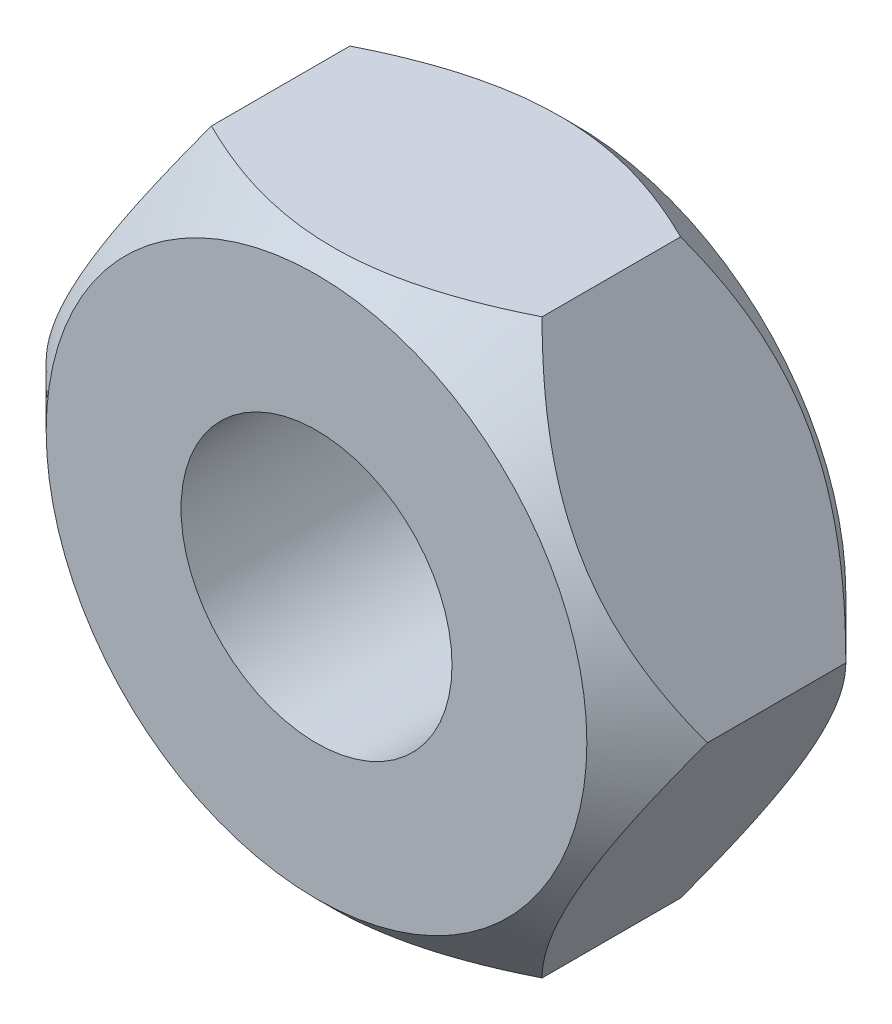
ISO-10303-21;
HEADER;
FILE_DESCRIPTION(('STEP AP214'),'2;1');
FILE_NAME('part.step','',(''),(''),'','','');
FILE_SCHEMA(('AUTOMOTIVE_DESIGN { 1 0 10303 214 1 1 1 1 }'));
ENDSEC;
DATA;
#1=APPLICATION_CONTEXT('core data for automotive mechanical design processes');
#2=APPLICATION_PROTOCOL_DEFINITION('international standard','automotive_design',2000,#1);
#3=PRODUCT_CONTEXT('',#1,'mechanical');
#4=PRODUCT('Part','Part','',(#3));
#5=PRODUCT_RELATED_PRODUCT_CATEGORY('part','',(#4));
#6=PRODUCT_DEFINITION_FORMATION('','',#4);
#7=PRODUCT_DEFINITION_CONTEXT('part definition',#1,'design');
#8=PRODUCT_DEFINITION('design','',#6,#7);
#9=PRODUCT_DEFINITION_SHAPE('','',#8);
#10=(LENGTH_UNIT() NAMED_UNIT(*) SI_UNIT(.MILLI.,.METRE.));
#11=(NAMED_UNIT(*) PLANE_ANGLE_UNIT() SI_UNIT($,.RADIAN.));
#12=(NAMED_UNIT(*) SI_UNIT($,.STERADIAN.) SOLID_ANGLE_UNIT());
#13=UNCERTAINTY_MEASURE_WITH_UNIT(LENGTH_MEASURE(1.E-05),#10,'distance_accuracy_value','');
#14=(GEOMETRIC_REPRESENTATION_CONTEXT(3) GLOBAL_UNCERTAINTY_ASSIGNED_CONTEXT((#13)) GLOBAL_UNIT_ASSIGNED_CONTEXT((#10,
#11,#12)) REPRESENTATION_CONTEXT('',''));
#15=CARTESIAN_POINT('',(0.,0.,0.));
#16=DIRECTION('',(0.,0.,1.));
#17=DIRECTION('',(1.,0.,0.));
#18=AXIS2_PLACEMENT_3D('',#15,#16,#17);
#19=CARTESIAN_POINT('',(-1.49999999999999,-2.59807621135331,0.));
#20=DIRECTION('',(0.,0.,1.));
#21=DIRECTION('',(1.,0.,0.));
#22=AXIS2_PLACEMENT_3D('',#19,#20,#21);
#23=PLANE('',#22);
#24=CARTESIAN_POINT('',(0.,0.,0.));
#25=DIRECTION('',(0.,0.,1.));
#26=DIRECTION('',(1.,0.,0.));
#27=AXIS2_PLACEMENT_3D('',#24,#25,#26);
#28=CIRCLE('',#27,1.2295);
#29=CARTESIAN_POINT('',(1.2295,0.,0.));
#30=VERTEX_POINT('',#29);
#31=EDGE_CURVE('E84',#30,#30,#28,.T.);
#32=ORIENTED_EDGE('',*,*,#31,.T.);
#33=EDGE_LOOP('',(#32));
#34=FACE_BOUND('',#33,.T.);
#35=CARTESIAN_POINT('',(0.,0.,0.));
#36=DIRECTION('',(0.,0.,1.));
#37=DIRECTION('',(1.,0.,0.));
#38=AXIS2_PLACEMENT_3D('',#35,#36,#37);
#39=CIRCLE('',#38,2.45329348486803);
#40=CARTESIAN_POINT('',(2.45329348486803,0.,0.));
#41=VERTEX_POINT('',#40);
#42=EDGE_CURVE('E19',#41,#41,#39,.T.);
#43=ORIENTED_EDGE('',*,*,#42,.F.);
#44=EDGE_LOOP('',(#43));
#45=FACE_BOUND('',#44,.T.);
#46=ADVANCED_FACE('F15',(#34,#45),#23,.F.);
#47=CARTESIAN_POINT('',(0.,0.,1.175));
#48=DIRECTION('',(0.,0.,1.));
#49=DIRECTION('',(1.,0.,0.));
#50=AXIS2_PLACEMENT_3D('',#47,#48,#49);
#51=CONICAL_SURFACE('',#50,3.62829348486803,0.785398163397447);
#52=ORIENTED_EDGE('',*,*,#42,.T.);
#53=EDGE_LOOP('',(#52));
#54=FACE_BOUND('',#53,.T.);
#55=CARTESIAN_POINT('',(3.00011547005384,0.000200000000002248,0.546821991852221));
#56=CARTESIAN_POINT('',(2.94855277650309,-0.0891092050050035,0.495302882241254));
#57=CARTESIAN_POINT('',(2.89612788326072,-0.179911783682159,0.446809533365483));
#58=CARTESIAN_POINT('',(2.78922773781038,-0.365068266938645,0.358019311509173));
#59=CARTESIAN_POINT('',(2.73474231883022,-0.459439780883969,0.317771842047577));
#60=CARTESIAN_POINT('',(2.62487506883104,-0.649735439970419,0.248827111604444));
#61=CARTESIAN_POINT('',(2.56952121892946,-0.745611120394499,0.219956558191336));
#62=CARTESIAN_POINT('',(2.45759490253746,-0.939473187089476,0.175475455486558));
#63=CARTESIAN_POINT('',(2.40102585535858,-1.03745365093906,0.159831701659996));
#64=CARTESIAN_POINT('',(2.30353224012888,-1.20631754593046,0.145716999971108));
#65=CARTESIAN_POINT('',(2.26273362746701,-1.27698281593915,0.14362755028283));
#66=CARTESIAN_POINT('',(2.18120309212938,-1.4181978455122,0.147147538792101));
#67=CARTESIAN_POINT('',(2.14047119784488,-1.48874755590149,0.152759676052897));
#68=CARTESIAN_POINT('',(2.05939201307723,-1.62918082335532,0.171363472834438));
#69=CARTESIAN_POINT('',(2.01904520425573,-1.69906354615743,0.18436338745856));
#70=CARTESIAN_POINT('',(1.93904928040641,-1.83762055066287,0.217029140781639));
#71=CARTESIAN_POINT('',(1.89940011213716,-1.90629492458305,0.236694468458787));
#72=CARTESIAN_POINT('',(1.79784249258705,-2.0821978815396,0.295074775409952));
#73=CARTESIAN_POINT('',(1.73656371984934,-2.18833582934677,0.338190160111078));
#74=CARTESIAN_POINT('',(1.64645863170301,-2.34440242003669,0.410974750688623));
#75=CARTESIAN_POINT('',(1.61676497746057,-2.39583333784698,0.436547893717545));
#76=CARTESIAN_POINT('',(1.55792768843088,-2.49774251182602,0.490025352046095));
#77=CARTESIAN_POINT('',(1.52878372928708,-2.54822132979679,0.517928236303693));
#78=CARTESIAN_POINT('',(1.49988452994617,-2.59827621135331,0.546821991852221));
#79=B_SPLINE_CURVE_WITH_KNOTS('',3,(#55,#56,#57,#58,#59,#60,#61,#62,#63,#64,#65,#66,#67,#68,#69,
#70,#71,#72,#73,#74,#75,#76,#77,#78),.UNSPECIFIED.,.F.,.F.,(4,2,2,2,2,2,2,2,2,2,2,4),(0.,
0.346074163660385,0.694164747986282,1.03672682350145,1.37842635662141,1.62295169669972,
1.86756275390828,2.11244767848963,2.3573138325552,2.74625844207635,2.94020339848825,
3.13403008860789),.UNSPECIFIED.);
#80=CARTESIAN_POINT('',(3.,0.,0.546706515131974));
#81=VERTEX_POINT('',#80);
#82=CARTESIAN_POINT('',(1.5,-2.59807621135331,0.546706515131971));
#83=VERTEX_POINT('',#82);
#84=EDGE_CURVE('E30',#81,#83,#79,.T.);
#85=ORIENTED_EDGE('',*,*,#84,.T.);
#86=CARTESIAN_POINT('',(-3.80350912944924,-2.59807621135332,2.1528634488245));
#87=CARTESIAN_POINT('',(-3.70778366379152,-2.59807621135332,2.073838586046));
#88=CARTESIAN_POINT('',(-3.61160683557952,-2.59807621135332,1.99535199928628));
#89=CARTESIAN_POINT('',(-3.41811677521425,-2.59807621135332,1.83974359260469));
#90=CARTESIAN_POINT('',(-3.32080326399708,-2.59807621135332,1.7626221200366));
#91=CARTESIAN_POINT('',(-3.12377066439065,-2.59807621135332,1.60922873690963));
#92=CARTESIAN_POINT('',(-3.02403687478413,-2.59807621135332,1.53297564894584));
#93=CARTESIAN_POINT('',(-2.82294264473001,-2.59807621135332,1.38266017924859));
#94=CARTESIAN_POINT('',(-2.72158236587452,-2.59807621135332,1.30859758194266));
#95=CARTESIAN_POINT('',(-2.50688663109645,-2.59807621135332,1.15616788589049));
#96=CARTESIAN_POINT('',(-2.39334766095522,-2.59807621135332,1.07808581847886));
#97=CARTESIAN_POINT('',(-2.16325208419808,-2.59807621135332,0.926376425231334));
#98=CARTESIAN_POINT('',(-2.04669446810094,-2.59807621135332,0.852750617837054));
#99=CARTESIAN_POINT('',(-1.81045230907259,-2.59807621135332,0.711951398300852));
#100=CARTESIAN_POINT('',(-1.69078500292649,-2.59807621135332,0.644749333414072));
#101=CARTESIAN_POINT('',(-1.44712532801577,-2.59807621135332,0.51879394488343));
#102=CARTESIAN_POINT('',(-1.32313694802484,-2.59807621135332,0.460033073114177));
#103=CARTESIAN_POINT('',(-1.10791398561965,-2.59807621135332,0.3700009735435));
#104=CARTESIAN_POINT('',(-1.01793220088155,-2.59807621135332,0.335756538677002));
#105=CARTESIAN_POINT('',(-0.835493617661211,-2.59807621135332,0.274466008098753));
#106=CARTESIAN_POINT('',(-0.743036484527009,-2.59807621135332,0.247420891154486));
#107=CARTESIAN_POINT('',(-0.558099551090686,-2.59807621135332,0.202572224289124));
#108=CARTESIAN_POINT('',(-0.465668229321029,-2.59807621135332,0.184572217079036));
#109=CARTESIAN_POINT('',(-0.279437905275911,-2.59807621135331,0.15814392353461));
#110=CARTESIAN_POINT('',(-0.185639254182871,-2.59807621135331,0.149713221826298));
#111=CARTESIAN_POINT('',(-0.00286700016591032,-2.59807621135331,0.143267875710212));
#112=CARTESIAN_POINT('',(0.0860872252265501,-2.59807621135331,0.144704104688729));
#113=CARTESIAN_POINT('',(0.263383941558781,-2.59807621135331,0.156600062669694));
#114=CARTESIAN_POINT('',(0.351726391231185,-2.59807621135331,0.167060394530606));
#115=CARTESIAN_POINT('',(0.528709715545319,-2.59807621135331,0.196567481224519));
#116=CARTESIAN_POINT('',(0.617322932984049,-2.59807621135331,0.215777392680383));
#117=CARTESIAN_POINT('',(0.79255077786214,-2.59807621135331,0.261662371903476));
#118=CARTESIAN_POINT('',(0.879165421988336,-2.59807621135331,0.288337377317411));
#119=CARTESIAN_POINT('',(1.13858438588009,-2.59807621135331,0.378618099263342));
#120=CARTESIAN_POINT('',(1.30802338603824,-2.59807621135331,0.451913785417774));
#121=CARTESIAN_POINT('',(1.55603490347591,-2.59807621135331,0.574259804065128));
#122=CARTESIAN_POINT('',(1.63782953061901,-2.59807621135331,0.617201786807756));
#123=CARTESIAN_POINT('',(1.79957308959519,-2.59807621135331,0.706438909822855));
#124=CARTESIAN_POINT('',(1.87952233518486,-2.59807621135331,0.752733474459483));
#125=CARTESIAN_POINT('',(2.03387519181043,-2.59807621135331,0.845652283020088));
#126=CARTESIAN_POINT('',(2.10835758287757,-2.59807621135331,0.892147120934487));
#127=CARTESIAN_POINT('',(2.25604412200337,-2.59807621135331,0.987133741894875));
#128=CARTESIAN_POINT('',(2.32924817502859,-2.59807621135331,1.03562567251514));
#129=CARTESIAN_POINT('',(2.47396079580908,-2.59807621135331,1.13386086794756));
#130=CARTESIAN_POINT('',(2.54547820472302,-2.59807621135331,1.18359116257481));
#131=CARTESIAN_POINT('',(2.68752952525409,-2.59807621135331,1.28439777980173));
#132=CARTESIAN_POINT('',(2.75806370232725,-2.59807621135331,1.33547372789699));
#133=CARTESIAN_POINT('',(2.82818506391955,-2.59807621135331,1.38710112451492));
#134=B_SPLINE_CURVE_WITH_KNOTS('',3,(#86,#87,#88,#89,#90,#91,#92,#93,#94,#95,#96,#97,#98,#99,
#100,#101,#102,#103,#104,#105,#106,#107,#108,#109,#110,#111,#112,#113,#114,#115,#116,#117,#118,
#119,#120,#121,#122,#123,#124,#125,#126,#127,#128,#129,#130,#131,#132,#133),.UNSPECIFIED.,.F.,
.F.,(4,2,2,2,2,2,2,2,2,2,2,2,2,2,2,2,2,2,2,2,2,2,2,4),(0.,0.372396476963739,0.744886386345558,
1.12149496460175,1.49806635555984,1.9113780602901,2.32482981450828,2.73634172711931,
3.14748334364566,3.43607713103734,3.72471013354955,4.0067691980231,4.28875705255052,
4.55518366841084,4.82162808437625,5.09325835797446,5.36488636280863,5.91702911931544,
6.19414916038391,6.47122173244487,6.73459875975045,6.99799528422772,7.25930337482963,
7.52053949423535),.UNSPECIFIED.);
#135=CARTESIAN_POINT('',(-1.5,-2.59807621135332,0.546706515131969));
#136=VERTEX_POINT('',#135);
#137=EDGE_CURVE('E65',#83,#136,#134,.F.);
#138=ORIENTED_EDGE('',*,*,#137,.T.);
#139=CARTESIAN_POINT('',(-1.49988452994616,-2.59827621135331,0.546821991852216));
#140=CARTESIAN_POINT('',(-1.55144722349691,-2.50896700634831,0.49530288224125));
#141=CARTESIAN_POINT('',(-1.60387211673928,-2.41816442767115,0.446809533365478));
#142=CARTESIAN_POINT('',(-1.71077226218961,-2.23300794441467,0.358019311509169));
#143=CARTESIAN_POINT('',(-1.76525768116978,-2.13863643046934,0.317771842047573));
#144=CARTESIAN_POINT('',(-1.87512493116896,-1.94834077138289,0.248827111604439));
#145=CARTESIAN_POINT('',(-1.93047878107054,-1.85246509095881,0.219956558191331));
#146=CARTESIAN_POINT('',(-2.04240509746254,-1.65860302426384,0.175475455486553));
#147=CARTESIAN_POINT('',(-2.09897414464142,-1.56062256041426,0.15983170165999));
#148=CARTESIAN_POINT('',(-2.19646775987111,-1.39175866542286,0.145716999971102));
#149=CARTESIAN_POINT('',(-2.23726637253299,-1.32109339541417,0.143627550282825));
#150=CARTESIAN_POINT('',(-2.31879690787061,-1.17987836584111,0.147147538792095));
#151=CARTESIAN_POINT('',(-2.35952880215512,-1.10932865545182,0.15275967605289));
#152=CARTESIAN_POINT('',(-2.44060798692277,-0.968895387997996,0.171363472834432));
#153=CARTESIAN_POINT('',(-2.48095479574427,-0.899012665195885,0.184363387458554));
#154=CARTESIAN_POINT('',(-2.56095071959359,-0.76045566069045,0.217029140781632));
#155=CARTESIAN_POINT('',(-2.60059988786283,-0.69178128677027,0.23669446845878));
#156=CARTESIAN_POINT('',(-2.70215750741295,-0.515878329813714,0.295074775409945));
#157=CARTESIAN_POINT('',(-2.76343628015066,-0.409740382006544,0.338190160111071));
#158=CARTESIAN_POINT('',(-2.85354136829699,-0.253673791316623,0.410974750688615));
#159=CARTESIAN_POINT('',(-2.88323502253943,-0.202242873506339,0.436547893717538));
#160=CARTESIAN_POINT('',(-2.94207231156912,-0.100333699527297,0.490025352046089));
#161=CARTESIAN_POINT('',(-2.97121627071292,-0.0498548815565259,0.517928236303686));
#162=CARTESIAN_POINT('',(-3.00011547005383,0.000199999999996396,0.546821991852214));
#163=B_SPLINE_CURVE_WITH_KNOTS('',3,(#139,#140,#141,#142,#143,#144,#145,#146,#147,#148,#149,
#150,#151,#152,#153,#154,#155,#156,#157,#158,#159,#160,#161,#162),.UNSPECIFIED.,.F.,.F.,(4,2,2,
2,2,2,2,2,2,2,2,4),(0.,0.346074163660385,0.694164747986283,1.03672682350145,1.37842635662141,
1.62295169669972,1.86756275390828,2.11244767848962,2.3573138325552,2.74625844207635,
2.94020339848825,3.13403008860789),.UNSPECIFIED.);
#164=CARTESIAN_POINT('',(-2.99999999999999,0.,0.546706515131966));
#165=VERTEX_POINT('',#164);
#166=EDGE_CURVE('E68',#136,#165,#163,.T.);
#167=ORIENTED_EDGE('',*,*,#166,.T.);
#168=CARTESIAN_POINT('',(-3.00011547005383,-0.000200000000003677,0.546821991852214));
#169=CARTESIAN_POINT('',(-2.94855277650308,0.0891092050050022,0.495302882241248));
#170=CARTESIAN_POINT('',(-2.89612788326071,0.179911783682157,0.446809533365476));
#171=CARTESIAN_POINT('',(-2.78922773781038,0.365068266938643,0.358019311509167));
#172=CARTESIAN_POINT('',(-2.73474231883021,0.459439780883967,0.317771842047571));
#173=CARTESIAN_POINT('',(-2.62487506883103,0.649735439970417,0.248827111604438));
#174=CARTESIAN_POINT('',(-2.56952121892945,0.745611120394496,0.21995655819133));
#175=CARTESIAN_POINT('',(-2.45759490253745,0.939473187089473,0.175475455486552));
#176=CARTESIAN_POINT('',(-2.40102585535857,1.03745365093905,0.15983170165999));
#177=CARTESIAN_POINT('',(-2.30353224012888,1.20631754593045,0.145716999971101));
#178=CARTESIAN_POINT('',(-2.262733627467,1.27698281593914,0.143627550282824));
#179=CARTESIAN_POINT('',(-2.18120309212938,1.4181978455122,0.147147538792095));
#180=CARTESIAN_POINT('',(-2.14047119784487,1.48874755590149,0.15275967605289));
#181=CARTESIAN_POINT('',(-2.05939201307723,1.62918082335531,0.171363472834431));
#182=CARTESIAN_POINT('',(-2.01904520425573,1.69906354615743,0.184363387458554));
#183=CARTESIAN_POINT('',(-1.93904928040641,1.83762055066286,0.217029140781632));
#184=CARTESIAN_POINT('',(-1.89940011213716,1.90629492458304,0.23669446845878));
#185=CARTESIAN_POINT('',(-1.79784249258704,2.0821978815396,0.295074775409945));
#186=CARTESIAN_POINT('',(-1.73656371984934,2.18833582934677,0.338190160111072));
#187=CARTESIAN_POINT('',(-1.646458631703,2.34440242003669,0.410974750688617));
#188=CARTESIAN_POINT('',(-1.61676497746057,2.39583333784697,0.43654789371754));
#189=CARTESIAN_POINT('',(-1.55792768843088,2.49774251182602,0.490025352046091));
#190=CARTESIAN_POINT('',(-1.52878372928708,2.54822132979679,0.517928236303689));
#191=CARTESIAN_POINT('',(-1.49988452994616,2.59827621135331,0.546821991852217));
#192=B_SPLINE_CURVE_WITH_KNOTS('',3,(#168,#169,#170,#171,#172,#173,#174,#175,#176,#177,#178,
#179,#180,#181,#182,#183,#184,#185,#186,#187,#188,#189,#190,#191),.UNSPECIFIED.,.F.,.F.,(4,2,2,
2,2,2,2,2,2,2,2,4),(0.,0.346074163660384,0.694164747986281,1.03672682350144,1.3784263566214,
1.62295169669972,1.86756275390827,2.11244767848962,2.35731383255519,2.74625844207635,
2.94020339848826,3.13403008860789),.UNSPECIFIED.);
#193=CARTESIAN_POINT('',(-1.5,2.59807621135331,0.546706515131968));
#194=VERTEX_POINT('',#193);
#195=EDGE_CURVE('E83',#165,#194,#192,.T.);
#196=ORIENTED_EDGE('',*,*,#195,.T.);
#197=CARTESIAN_POINT('',(-3.80350912944924,2.5980762113533,2.15286344882449));
#198=CARTESIAN_POINT('',(-3.70778366379152,2.5980762113533,2.07383858604599));
#199=CARTESIAN_POINT('',(-3.61160683557952,2.5980762113533,1.99535199928627));
#200=CARTESIAN_POINT('',(-3.41811677521425,2.59807621135331,1.83974359260468));
#201=CARTESIAN_POINT('',(-3.32080326399708,2.59807621135331,1.76262212003659));
#202=CARTESIAN_POINT('',(-3.12377066439065,2.59807621135331,1.60922873690962));
#203=CARTESIAN_POINT('',(-3.02403687478413,2.59807621135331,1.53297564894583));
#204=CARTESIAN_POINT('',(-2.82294264473002,2.59807621135331,1.38266017924859));
#205=CARTESIAN_POINT('',(-2.72158236587452,2.59807621135331,1.30859758194265));
#206=CARTESIAN_POINT('',(-2.50688663109645,2.59807621135331,1.15616788589048));
#207=CARTESIAN_POINT('',(-2.39334766095522,2.59807621135331,1.07808581847885));
#208=CARTESIAN_POINT('',(-2.16325208419808,2.59807621135331,0.926376425231329));
#209=CARTESIAN_POINT('',(-2.04669446810095,2.59807621135331,0.852750617837049));
#210=CARTESIAN_POINT('',(-1.8104523090726,2.59807621135331,0.711951398300848));
#211=CARTESIAN_POINT('',(-1.6907850029265,2.59807621135331,0.644749333414069));
#212=CARTESIAN_POINT('',(-1.44712532801577,2.59807621135331,0.518793944883427));
#213=CARTESIAN_POINT('',(-1.32313694802485,2.59807621135331,0.460033073114175));
#214=CARTESIAN_POINT('',(-1.10791398561966,2.59807621135331,0.370000973543498));
#215=CARTESIAN_POINT('',(-1.01793220088156,2.59807621135331,0.335756538677));
#216=CARTESIAN_POINT('',(-0.835493617661218,2.59807621135331,0.274466008098751));
#217=CARTESIAN_POINT('',(-0.743036484527017,2.59807621135331,0.247420891154485));
#218=CARTESIAN_POINT('',(-0.558099551090694,2.59807621135331,0.202572224289124));
#219=CARTESIAN_POINT('',(-0.465668229321038,2.59807621135331,0.184572217079036));
#220=CARTESIAN_POINT('',(-0.279437905275921,2.59807621135331,0.15814392353461));
#221=CARTESIAN_POINT('',(-0.185639254182881,2.59807621135331,0.149713221826298));
#222=CARTESIAN_POINT('',(-0.00286700016592043,2.59807621135331,0.143267875710212));
#223=CARTESIAN_POINT('',(0.0860872252265397,2.59807621135331,0.144704104688729));
#224=CARTESIAN_POINT('',(0.26338394155877,2.59807621135332,0.156600062669694));
#225=CARTESIAN_POINT('',(0.351726391231174,2.59807621135332,0.167060394530605));
#226=CARTESIAN_POINT('',(0.528709715545308,2.59807621135332,0.196567481224519));
#227=CARTESIAN_POINT('',(0.617322932984038,2.59807621135332,0.215777392680383));
#228=CARTESIAN_POINT('',(0.792550777862128,2.59807621135332,0.261662371903477));
#229=CARTESIAN_POINT('',(0.879165421988324,2.59807621135332,0.288337377317412));
#230=CARTESIAN_POINT('',(1.13858438588008,2.59807621135332,0.378618099263342));
#231=CARTESIAN_POINT('',(1.30802338603823,2.59807621135332,0.451913785417774));
#232=CARTESIAN_POINT('',(1.5560349034759,2.59807621135332,0.574259804065128));
#233=CARTESIAN_POINT('',(1.637829530619,2.59807621135332,0.617201786807757));
#234=CARTESIAN_POINT('',(1.79957308959518,2.59807621135332,0.706438909822856));
#235=CARTESIAN_POINT('',(1.87952233518485,2.59807621135332,0.752733474459484));
#236=CARTESIAN_POINT('',(2.03387519181042,2.59807621135332,0.845652283020089));
#237=CARTESIAN_POINT('',(2.10835758287756,2.59807621135332,0.892147120934488));
#238=CARTESIAN_POINT('',(2.25604412200336,2.59807621135332,0.987133741894875));
#239=CARTESIAN_POINT('',(2.32924817502857,2.59807621135332,1.03562567251514));
#240=CARTESIAN_POINT('',(2.47396079580907,2.59807621135332,1.13386086794756));
#241=CARTESIAN_POINT('',(2.54547820472301,2.59807621135332,1.18359116257481));
#242=CARTESIAN_POINT('',(2.68752952525408,2.59807621135332,1.28439777980173));
#243=CARTESIAN_POINT('',(2.75806370232724,2.59807621135332,1.33547372789699));
#244=CARTESIAN_POINT('',(2.82818506391954,2.59807621135332,1.38710112451492));
#245=B_SPLINE_CURVE_WITH_KNOTS('',3,(#197,#198,#199,#200,#201,#202,#203,#204,#205,#206,#207,
#208,#209,#210,#211,#212,#213,#214,#215,#216,#217,#218,#219,#220,#221,#222,#223,#224,#225,#226,
#227,#228,#229,#230,#231,#232,#233,#234,#235,#236,#237,#238,#239,#240,#241,#242,#243,#244),
.UNSPECIFIED.,.F.,.F.,(4,2,2,2,2,2,2,2,2,2,2,2,2,2,2,2,2,2,2,2,2,2,2,4),(0.,0.372396476963738,
0.744886386345556,1.12149496460174,1.49806635555983,1.91137806029009,2.32482981450827,
2.7363417271193,3.14748334364565,3.43607713103733,3.72471013354954,4.00676919802308,
4.28875705255051,4.55518366841083,4.82162808437624,5.09325835797444,5.36488636280861,
5.91702911931542,6.1941491603839,6.47122173244486,6.73459875975044,6.9979952842277,
7.25930337482962,7.52053949423533),.UNSPECIFIED.);
#246=CARTESIAN_POINT('',(1.5,2.59807621135332,0.546706515131974));
#247=VERTEX_POINT('',#246);
#248=EDGE_CURVE('E75',#194,#247,#245,.T.);
#249=ORIENTED_EDGE('',*,*,#248,.T.);
#250=CARTESIAN_POINT('',(1.49988452994616,2.59827621135331,0.546821991852219));
#251=CARTESIAN_POINT('',(1.55144722349691,2.50896700634831,0.495302882241253));
#252=CARTESIAN_POINT('',(1.60387211673928,2.41816442767115,0.446809533365481));
#253=CARTESIAN_POINT('',(1.71077226218962,2.23300794441467,0.358019311509172));
#254=CARTESIAN_POINT('',(1.76525768116978,2.13863643046934,0.317771842047576));
#255=CARTESIAN_POINT('',(1.87512493116896,1.9483407713829,0.248827111604444));
#256=CARTESIAN_POINT('',(1.93047878107054,1.85246509095882,0.219956558191336));
#257=CARTESIAN_POINT('',(2.04240509746255,1.65860302426384,0.175475455486558));
#258=CARTESIAN_POINT('',(2.09897414464143,1.56062256041426,0.159831701659996));
#259=CARTESIAN_POINT('',(2.19646775987112,1.39175866542286,0.145716999971107));
#260=CARTESIAN_POINT('',(2.23726637253299,1.32109339541417,0.14362755028283));
#261=CARTESIAN_POINT('',(2.31879690787062,1.17987836584111,0.1471475387921));
#262=CARTESIAN_POINT('',(2.35952880215513,1.10932865545182,0.152759676052896));
#263=CARTESIAN_POINT('',(2.44060798692277,0.968895387998,0.171363472834438));
#264=CARTESIAN_POINT('',(2.48095479574427,0.899012665195888,0.18436338745856));
#265=CARTESIAN_POINT('',(2.56095071959359,0.760455660690453,0.217029140781637));
#266=CARTESIAN_POINT('',(2.60059988786284,0.691781286770273,0.236694468458786));
#267=CARTESIAN_POINT('',(2.70215750741296,0.515878329813716,0.295074775409952));
#268=CARTESIAN_POINT('',(2.76343628015066,0.409740382006545,0.338190160111078));
#269=CARTESIAN_POINT('',(2.853541368297,0.253673791316623,0.410974750688623));
#270=CARTESIAN_POINT('',(2.88323502253944,0.202242873506339,0.436547893717546));
#271=CARTESIAN_POINT('',(2.94207231156913,0.100333699527296,0.490025352046097));
#272=CARTESIAN_POINT('',(2.97121627071293,0.0498548815565249,0.517928236303695));
#273=CARTESIAN_POINT('',(3.00011547005384,-0.000199999999997579,0.546821991852223));
#274=B_SPLINE_CURVE_WITH_KNOTS('',3,(#250,#251,#252,#253,#254,#255,#256,#257,#258,#259,#260,
#261,#262,#263,#264,#265,#266,#267,#268,#269,#270,#271,#272,#273),.UNSPECIFIED.,.F.,.F.,(4,2,2,
2,2,2,2,2,2,2,2,4),(0.,0.346074163660384,0.694164747986281,1.03672682350144,1.3784263566214,
1.62295169669972,1.86756275390827,2.11244767848962,2.35731383255519,2.74625844207635,
2.94020339848826,3.13403008860789),.UNSPECIFIED.);
#275=EDGE_CURVE('E74',#247,#81,#274,.T.);
#276=ORIENTED_EDGE('',*,*,#275,.T.);
#277=EDGE_LOOP('',(#85,#138,#167,#196,#249,#276));
#278=FACE_BOUND('',#277,.T.);
#279=ADVANCED_FACE('F67',(#54,#278),#51,.T.);
#280=CARTESIAN_POINT('',(1.5,-2.59807621135331,2.35));
#281=DIRECTION('',(0.,1.,0.));
#282=DIRECTION('',(-1.,0.,0.));
#283=AXIS2_PLACEMENT_3D('',#280,#281,#282);
#284=PLANE('',#283);
#285=CARTESIAN_POINT('',(-3.80350912944925,-2.59807621135332,0.197136551175498));
#286=CARTESIAN_POINT('',(-3.70778366379153,-2.59807621135332,0.276161413954005));
#287=CARTESIAN_POINT('',(-3.61160683557953,-2.59807621135332,0.354648000713724));
#288=CARTESIAN_POINT('',(-3.41811677521426,-2.59807621135332,0.510256407395316));
#289=CARTESIAN_POINT('',(-3.32080326399709,-2.59807621135332,0.587377879963403));
#290=CARTESIAN_POINT('',(-3.12377066439065,-2.59807621135332,0.740771263090372));
#291=CARTESIAN_POINT('',(-3.02403687478413,-2.59807621135332,0.817024351054164));
#292=CARTESIAN_POINT('',(-2.82294264473002,-2.59807621135332,0.967339820751409));
#293=CARTESIAN_POINT('',(-2.72158236587452,-2.59807621135332,1.04140241805734));
#294=CARTESIAN_POINT('',(-2.50688663109645,-2.59807621135332,1.19383211410951));
#295=CARTESIAN_POINT('',(-2.39334766095522,-2.59807621135332,1.27191418152114));
#296=CARTESIAN_POINT('',(-2.16325208419808,-2.59807621135332,1.42362357476867));
#297=CARTESIAN_POINT('',(-2.04669446810094,-2.59807621135332,1.49724938216295));
#298=CARTESIAN_POINT('',(-1.81045230907259,-2.59807621135332,1.63804860169915));
#299=CARTESIAN_POINT('',(-1.69078500292649,-2.59807621135332,1.70525066658593));
#300=CARTESIAN_POINT('',(-1.44712532801577,-2.59807621135332,1.83120605511657));
#301=CARTESIAN_POINT('',(-1.32313694802484,-2.59807621135332,1.88996692688582));
#302=CARTESIAN_POINT('',(-1.10791398561965,-2.59807621135332,1.9799990264565));
#303=CARTESIAN_POINT('',(-1.01793220088155,-2.59807621135332,2.014243461323));
#304=CARTESIAN_POINT('',(-0.835493617661208,-2.59807621135332,2.07553399190125));
#305=CARTESIAN_POINT('',(-0.743036484527007,-2.59807621135332,2.10257910884551));
#306=CARTESIAN_POINT('',(-0.558099551090683,-2.59807621135332,2.14742777571088));
#307=CARTESIAN_POINT('',(-0.465668229321026,-2.59807621135332,2.16542778292096));
#308=CARTESIAN_POINT('',(-0.279437905275908,-2.59807621135331,2.19185607646539));
#309=CARTESIAN_POINT('',(-0.185639254182867,-2.59807621135331,2.2002867781737));
#310=CARTESIAN_POINT('',(-0.00286700016590566,-2.59807621135331,2.20673212428979));
#311=CARTESIAN_POINT('',(0.086087225226555,-2.59807621135331,2.20529589531127));
#312=CARTESIAN_POINT('',(0.263383941558787,-2.59807621135331,2.19339993733031));
#313=CARTESIAN_POINT('',(0.351726391231191,-2.59807621135331,2.18293960546939));
#314=CARTESIAN_POINT('',(0.528709715545325,-2.59807621135331,2.15343251877548));
#315=CARTESIAN_POINT('',(0.617322932984055,-2.59807621135331,2.13422260731962));
#316=CARTESIAN_POINT('',(0.792550777862147,-2.59807621135331,2.08833762809652));
#317=CARTESIAN_POINT('',(0.879165421988343,-2.59807621135331,2.06166262268259));
#318=CARTESIAN_POINT('',(1.1385843858801,-2.59807621135331,1.97138190073666));
#319=CARTESIAN_POINT('',(1.30802338603825,-2.59807621135331,1.89808621458222));
#320=CARTESIAN_POINT('',(1.55603490347592,-2.59807621135331,1.77574019593487));
#321=CARTESIAN_POINT('',(1.63782953061902,-2.59807621135331,1.73279821319224));
#322=CARTESIAN_POINT('',(1.79957308959521,-2.59807621135331,1.64356109017714));
#323=CARTESIAN_POINT('',(1.87952233518488,-2.59807621135331,1.59726652554051));
#324=CARTESIAN_POINT('',(2.03387519181045,-2.59807621135331,1.5043477169799));
#325=CARTESIAN_POINT('',(2.10835758287759,-2.59807621135331,1.4578528790655));
#326=CARTESIAN_POINT('',(2.25604412200339,-2.59807621135331,1.36286625810511));
#327=CARTESIAN_POINT('',(2.32924817502861,-2.59807621135331,1.31437432748485));
#328=CARTESIAN_POINT('',(2.47396079580911,-2.59807621135331,1.21613913205243));
#329=CARTESIAN_POINT('',(2.54547820472304,-2.59807621135331,1.16640883742518));
#330=CARTESIAN_POINT('',(2.68752952525412,-2.59807621135331,1.06560222019825));
#331=CARTESIAN_POINT('',(2.75806370232728,-2.59807621135331,1.01452627210299));
#332=CARTESIAN_POINT('',(2.82818506391958,-2.59807621135331,0.962898875485063));
#333=B_SPLINE_CURVE_WITH_KNOTS('',3,(#285,#286,#287,#288,#289,#290,#291,#292,#293,#294,#295,
#296,#297,#298,#299,#300,#301,#302,#303,#304,#305,#306,#307,#308,#309,#310,#311,#312,#313,#314,
#315,#316,#317,#318,#319,#320,#321,#322,#323,#324,#325,#326,#327,#328,#329,#330,#331,#332),
.UNSPECIFIED.,.F.,.F.,(4,2,2,2,2,2,2,2,2,2,2,2,2,2,2,2,2,2,2,2,2,2,2,4),(0.,0.37239647696374,
0.74488638634556,1.12149496460175,1.49806635555984,1.91137806029011,2.32482981450829,
2.73634172711932,3.14748334364567,3.43607713103736,3.72471013354956,4.00676919802311,
4.28875705255053,4.55518366841086,4.82162808437627,5.09325835797447,5.36488636280864,
5.91702911931546,6.19414916038394,6.47122173244491,6.73459875975049,6.99799528422776,
7.25930337482967,7.52053949423539),.UNSPECIFIED.);
#334=CARTESIAN_POINT('',(-1.49999999999999,-2.59807621135331,1.80329348486803));
#335=VERTEX_POINT('',#334);
#336=CARTESIAN_POINT('',(1.50000000000001,-2.59807621135331,1.80329348486803));
#337=VERTEX_POINT('',#336);
#338=EDGE_CURVE('E87',#335,#337,#333,.T.);
#339=ORIENTED_EDGE('',*,*,#338,.F.);
#340=DIRECTION('',(0.,0.,-1.));
#341=VECTOR('',#340,1.);
#342=CARTESIAN_POINT('',(-1.49999999999999,-2.59807621135331,2.35));
#343=LINE('',#342,#341);
#344=EDGE_CURVE('E80',#335,#136,#343,.T.);
#345=ORIENTED_EDGE('',*,*,#344,.T.);
#346=ORIENTED_EDGE('',*,*,#137,.F.);
#347=DIRECTION('',(0.,0.,-1.));
#348=VECTOR('',#347,1.);
#349=CARTESIAN_POINT('',(1.5,-2.59807621135331,2.35));
#350=LINE('',#349,#348);
#351=EDGE_CURVE('E88',#337,#83,#350,.T.);
#352=ORIENTED_EDGE('',*,*,#351,.F.);
#353=EDGE_LOOP('',(#339,#345,#346,#352));
#354=FACE_BOUND('',#353,.T.);
#355=ADVANCED_FACE('F86',(#354),#284,.F.);
#356=CARTESIAN_POINT('',(3.,0.,2.35));
#357=DIRECTION('',(-0.866025403784439,0.499999999999998,0.));
#358=DIRECTION('',(-0.499999999999999,-0.86602540378444,0.));
#359=AXIS2_PLACEMENT_3D('',#356,#357,#358);
#360=PLANE('',#359);
#361=CARTESIAN_POINT('',(1.49988452994617,-2.59827621135331,1.80317800814778));
#362=CARTESIAN_POINT('',(1.55144722349692,-2.50896700634831,1.85469711775875));
#363=CARTESIAN_POINT('',(1.60387211673929,-2.41816442767115,1.90319046663452));
#364=CARTESIAN_POINT('',(1.71077226218963,-2.23300794441466,1.99198068849083));
#365=CARTESIAN_POINT('',(1.76525768116979,-2.13863643046934,2.03222815795242));
#366=CARTESIAN_POINT('',(1.87512493116897,-1.94834077138289,2.10117288839556));
#367=CARTESIAN_POINT('',(1.93047878107055,-1.85246509095881,2.13004344180866));
#368=CARTESIAN_POINT('',(2.04240509746255,-1.65860302426383,2.17452454451344));
#369=CARTESIAN_POINT('',(2.09897414464143,-1.56062256041425,2.19016829834));
#370=CARTESIAN_POINT('',(2.19646775987113,-1.39175866542285,2.20428300002889));
#371=CARTESIAN_POINT('',(2.237266372533,-1.32109339541416,2.20637244971717));
#372=CARTESIAN_POINT('',(2.31879690787063,-1.1798783658411,2.2028524612079));
#373=CARTESIAN_POINT('',(2.35952880215513,-1.10932865545181,2.1972403239471));
#374=CARTESIAN_POINT('',(2.44060798692278,-0.968895387997986,2.17863652716556));
#375=CARTESIAN_POINT('',(2.48095479574428,-0.899012665195874,2.16563661254144));
#376=CARTESIAN_POINT('',(2.5609507195936,-0.760455660690437,2.13297085921836));
#377=CARTESIAN_POINT('',(2.60059988786285,-0.691781286770257,2.11330553154121));
#378=CARTESIAN_POINT('',(2.70215750741297,-0.515878329813701,2.05492522459005));
#379=CARTESIAN_POINT('',(2.76343628015067,-0.409740382006532,2.01180983988892));
#380=CARTESIAN_POINT('',(2.853541368297,-0.253673791316613,1.93902524931138));
#381=CARTESIAN_POINT('',(2.88323502253944,-0.20224287350633,1.91345210628245));
#382=CARTESIAN_POINT('',(2.94207231156913,-0.10033369952729,1.85997464795391));
#383=CARTESIAN_POINT('',(2.97121627071293,-0.0498548815565191,1.83207176369631));
#384=CARTESIAN_POINT('',(3.00011547005384,0.000200000000002303,1.80317800814778));
#385=B_SPLINE_CURVE_WITH_KNOTS('',3,(#361,#362,#363,#364,#365,#366,#367,#368,#369,#370,#371,
#372,#373,#374,#375,#376,#377,#378,#379,#380,#381,#382,#383,#384),.UNSPECIFIED.,.F.,.F.,(4,2,2,
2,2,2,2,2,2,2,2,4),(0.,0.346074163660386,0.694164747986284,1.03672682350145,1.37842635662141,
1.62295169669973,1.86756275390828,2.11244767848963,2.35731383255521,2.74625844207636,
2.94020339848826,3.13403008860789),.UNSPECIFIED.);
#386=CARTESIAN_POINT('',(3.,0.,1.80329348486803));
#387=VERTEX_POINT('',#386);
#388=EDGE_CURVE('E109',#337,#387,#385,.T.);
#389=ORIENTED_EDGE('',*,*,#388,.F.);
#390=ORIENTED_EDGE('',*,*,#351,.T.);
#391=ORIENTED_EDGE('',*,*,#84,.F.);
#392=DIRECTION('',(0.,0.,-1.));
#393=VECTOR('',#392,1.);
#394=CARTESIAN_POINT('',(3.,0.,2.35));
#395=LINE('',#394,#393);
#396=EDGE_CURVE('E91',#387,#81,#395,.T.);
#397=ORIENTED_EDGE('',*,*,#396,.F.);
#398=EDGE_LOOP('',(#389,#390,#391,#397));
#399=FACE_BOUND('',#398,.T.);
#400=ADVANCED_FACE('F203',(#399),#360,.F.);
#401=CARTESIAN_POINT('',(1.5,2.59807621135331,2.35));
#402=DIRECTION('',(-0.866025403784438,-0.500000000000001,0.));
#403=DIRECTION('',(0.500000000000001,-0.866025403784438,0.));
#404=AXIS2_PLACEMENT_3D('',#401,#402,#403);
#405=PLANE('',#404);
#406=CARTESIAN_POINT('',(3.00011547005384,-0.00019999999999772,1.80317800814778));
#407=CARTESIAN_POINT('',(2.94855277650309,0.0891092050050084,1.85469711775875));
#408=CARTESIAN_POINT('',(2.89612788326072,0.179911783682164,1.90319046663452));
#409=CARTESIAN_POINT('',(2.78922773781038,0.365068266938651,1.99198068849083));
#410=CARTESIAN_POINT('',(2.73474231883022,0.459439780883976,2.03222815795242));
#411=CARTESIAN_POINT('',(2.62487506883104,0.649735439970426,2.10117288839556));
#412=CARTESIAN_POINT('',(2.56952121892946,0.745611120394506,2.13004344180866));
#413=CARTESIAN_POINT('',(2.45759490253745,0.939473187089484,2.17452454451344));
#414=CARTESIAN_POINT('',(2.40102585535857,1.03745365093907,2.19016829834));
#415=CARTESIAN_POINT('',(2.30353224012888,1.20631754593047,2.20428300002889));
#416=CARTESIAN_POINT('',(2.262733627467,1.27698281593916,2.20637244971717));
#417=CARTESIAN_POINT('',(2.18120309212938,1.41819784551222,2.2028524612079));
#418=CARTESIAN_POINT('',(2.14047119784487,1.4887475559015,2.1972403239471));
#419=CARTESIAN_POINT('',(2.05939201307723,1.62918082335533,2.17863652716556));
#420=CARTESIAN_POINT('',(2.01904520425572,1.69906354615744,2.16563661254144));
#421=CARTESIAN_POINT('',(1.9390492804064,1.83762055066288,2.13297085921836));
#422=CARTESIAN_POINT('',(1.89940011213715,1.90629492458306,2.11330553154121));
#423=CARTESIAN_POINT('',(1.79784249258704,2.08219788153961,2.05492522459005));
#424=CARTESIAN_POINT('',(1.73656371984933,2.18833582934678,2.01180983988892));
#425=CARTESIAN_POINT('',(1.646458631703,2.3444024200367,1.93902524931138));
#426=CARTESIAN_POINT('',(1.61676497746056,2.39583333784698,1.91345210628246));
#427=CARTESIAN_POINT('',(1.55792768843087,2.49774251182602,1.85997464795391));
#428=CARTESIAN_POINT('',(1.52878372928707,2.54822132979679,1.83207176369631));
#429=CARTESIAN_POINT('',(1.49988452994616,2.59827621135331,1.80317800814778));
#430=B_SPLINE_CURVE_WITH_KNOTS('',3,(#406,#407,#408,#409,#410,#411,#412,#413,#414,#415,#416,
#417,#418,#419,#420,#421,#422,#423,#424,#425,#426,#427,#428,#429),.UNSPECIFIED.,.F.,.F.,(4,2,2,
2,2,2,2,2,2,2,2,4),(0.,0.346074163660387,0.694164747986286,1.03672682350145,1.37842635662141,
1.62295169669973,1.86756275390829,2.11244767848964,2.35731383255521,2.74625844207636,
2.94020339848826,3.13403008860789),.UNSPECIFIED.);
#431=CARTESIAN_POINT('',(1.5,2.59807621135332,1.80329348486803));
#432=VERTEX_POINT('',#431);
#433=EDGE_CURVE('E146',#387,#432,#430,.T.);
#434=ORIENTED_EDGE('',*,*,#433,.F.);
#435=ORIENTED_EDGE('',*,*,#396,.T.);
#436=ORIENTED_EDGE('',*,*,#275,.F.);
#437=DIRECTION('',(0.,0.,-1.));
#438=VECTOR('',#437,1.);
#439=CARTESIAN_POINT('',(1.5,2.59807621135331,2.35));
#440=LINE('',#439,#438);
#441=EDGE_CURVE('E96',#432,#247,#440,.T.);
#442=ORIENTED_EDGE('',*,*,#441,.F.);
#443=EDGE_LOOP('',(#434,#435,#436,#442));
#444=FACE_BOUND('',#443,.T.);
#445=ADVANCED_FACE('F206',(#444),#405,.F.);
#446=CARTESIAN_POINT('',(-1.5,2.59807621135331,2.35));
#447=DIRECTION('',(0.,-1.,0.));
#448=DIRECTION('',(1.,0.,0.));
#449=AXIS2_PLACEMENT_3D('',#446,#447,#448);
#450=PLANE('',#449);
#451=CARTESIAN_POINT('',(-3.80350912944925,2.5980762113533,0.197136551175509));
#452=CARTESIAN_POINT('',(-3.70778366379153,2.5980762113533,0.276161413954016));
#453=CARTESIAN_POINT('',(-3.61160683557953,2.5980762113533,0.354648000713734));
#454=CARTESIAN_POINT('',(-3.41811677521426,2.59807621135331,0.510256407395326));
#455=CARTESIAN_POINT('',(-3.32080326399709,2.59807621135331,0.587377879963412));
#456=CARTESIAN_POINT('',(-3.12377066439065,2.59807621135331,0.740771263090381));
#457=CARTESIAN_POINT('',(-3.02403687478413,2.59807621135331,0.817024351054172));
#458=CARTESIAN_POINT('',(-2.82294264473002,2.59807621135331,0.967339820751415));
#459=CARTESIAN_POINT('',(-2.72158236587453,2.59807621135331,1.04140241805735));
#460=CARTESIAN_POINT('',(-2.50688663109646,2.59807621135331,1.19383211410952));
#461=CARTESIAN_POINT('',(-2.39334766095523,2.59807621135331,1.27191418152115));
#462=CARTESIAN_POINT('',(-2.16325208419809,2.59807621135331,1.42362357476867));
#463=CARTESIAN_POINT('',(-2.04669446810095,2.59807621135331,1.49724938216295));
#464=CARTESIAN_POINT('',(-1.8104523090726,2.59807621135331,1.63804860169915));
#465=CARTESIAN_POINT('',(-1.6907850029265,2.59807621135331,1.70525066658593));
#466=CARTESIAN_POINT('',(-1.44712532801577,2.59807621135331,1.83120605511657));
#467=CARTESIAN_POINT('',(-1.32313694802485,2.59807621135331,1.88996692688583));
#468=CARTESIAN_POINT('',(-1.10791398561966,2.59807621135331,1.9799990264565));
#469=CARTESIAN_POINT('',(-1.01793220088156,2.59807621135331,2.014243461323));
#470=CARTESIAN_POINT('',(-0.835493617661217,2.59807621135331,2.07553399190125));
#471=CARTESIAN_POINT('',(-0.743036484527015,2.59807621135331,2.10257910884552));
#472=CARTESIAN_POINT('',(-0.558099551090691,2.59807621135331,2.14742777571088));
#473=CARTESIAN_POINT('',(-0.465668229321034,2.59807621135331,2.16542778292097));
#474=CARTESIAN_POINT('',(-0.279437905275916,2.59807621135331,2.19185607646539));
#475=CARTESIAN_POINT('',(-0.185639254182876,2.59807621135331,2.2002867781737));
#476=CARTESIAN_POINT('',(-0.00286700016591524,2.59807621135331,2.20673212428979));
#477=CARTESIAN_POINT('',(0.0860872252265455,2.59807621135331,2.20529589531127));
#478=CARTESIAN_POINT('',(0.263383941558777,2.59807621135332,2.19339993733031));
#479=CARTESIAN_POINT('',(0.35172639123118,2.59807621135332,2.18293960546939));
#480=CARTESIAN_POINT('',(0.528709715545314,2.59807621135332,2.15343251877548));
#481=CARTESIAN_POINT('',(0.617322932984045,2.59807621135332,2.13422260731961));
#482=CARTESIAN_POINT('',(0.792550777862135,2.59807621135332,2.08833762809652));
#483=CARTESIAN_POINT('',(0.879165421988332,2.59807621135332,2.06166262268259));
#484=CARTESIAN_POINT('',(1.13858438588009,2.59807621135332,1.97138190073666));
#485=CARTESIAN_POINT('',(1.30802338603824,2.59807621135332,1.89808621458222));
#486=CARTESIAN_POINT('',(1.55603490347591,2.59807621135332,1.77574019593487));
#487=CARTESIAN_POINT('',(1.63782953061901,2.59807621135332,1.73279821319224));
#488=CARTESIAN_POINT('',(1.7995730895952,2.59807621135332,1.64356109017714));
#489=CARTESIAN_POINT('',(1.87952233518487,2.59807621135332,1.59726652554051));
#490=CARTESIAN_POINT('',(2.03387519181044,2.59807621135332,1.5043477169799));
#491=CARTESIAN_POINT('',(2.10835758287758,2.59807621135332,1.4578528790655));
#492=CARTESIAN_POINT('',(2.25604412200338,2.59807621135332,1.36286625810512));
#493=CARTESIAN_POINT('',(2.3292481750286,2.59807621135332,1.31437432748485));
#494=CARTESIAN_POINT('',(2.4739607958091,2.59807621135332,1.21613913205243));
#495=CARTESIAN_POINT('',(2.54547820472303,2.59807621135332,1.16640883742518));
#496=CARTESIAN_POINT('',(2.68752952525411,2.59807621135332,1.06560222019825));
#497=CARTESIAN_POINT('',(2.75806370232726,2.59807621135332,1.014526272103));
#498=CARTESIAN_POINT('',(2.82818506391956,2.59807621135332,0.962898875485065));
#499=B_SPLINE_CURVE_WITH_KNOTS('',3,(#451,#452,#453,#454,#455,#456,#457,#458,#459,#460,#461,
#462,#463,#464,#465,#466,#467,#468,#469,#470,#471,#472,#473,#474,#475,#476,#477,#478,#479,#480,
#481,#482,#483,#484,#485,#486,#487,#488,#489,#490,#491,#492,#493,#494,#495,#496,#497,#498),
.UNSPECIFIED.,.F.,.F.,(4,2,2,2,2,2,2,2,2,2,2,2,2,2,2,2,2,2,2,2,2,2,2,4),(0.,0.372396476963739,
0.744886386345557,1.12149496460174,1.49806635555984,1.9113780602901,2.32482981450828,
2.73634172711931,3.14748334364566,3.43607713103734,3.72471013354955,4.00676919802309,
4.28875705255052,4.55518366841084,4.82162808437625,5.09325835797445,5.36488636280862,
5.91702911931544,6.19414916038392,6.47122173244488,6.73459875975047,6.99799528422773,
7.25930337482965,7.52053949423537),.UNSPECIFIED.);
#500=CARTESIAN_POINT('',(-1.5,2.59807621135331,1.80329348486803));
#501=VERTEX_POINT('',#500);
#502=EDGE_CURVE('E141',#432,#501,#499,.F.);
#503=ORIENTED_EDGE('',*,*,#502,.F.);
#504=ORIENTED_EDGE('',*,*,#441,.T.);
#505=ORIENTED_EDGE('',*,*,#248,.F.);
#506=DIRECTION('',(0.,0.,-1.));
#507=VECTOR('',#506,1.);
#508=CARTESIAN_POINT('',(-1.5,2.59807621135331,2.35));
#509=LINE('',#508,#507);
#510=EDGE_CURVE('E99',#501,#194,#509,.T.);
#511=ORIENTED_EDGE('',*,*,#510,.F.);
#512=EDGE_LOOP('',(#503,#504,#505,#511));
#513=FACE_BOUND('',#512,.T.);
#514=ADVANCED_FACE('F176',(#513),#450,.F.);
#515=CARTESIAN_POINT('',(-2.99999999999999,0.,2.35));
#516=DIRECTION('',(0.86602540378444,-0.499999999999998,0.));
#517=DIRECTION('',(0.499999999999998,0.86602540378444,0.));
#518=AXIS2_PLACEMENT_3D('',#515,#516,#517);
#519=PLANE('',#518);
#520=CARTESIAN_POINT('',(-1.49988452994616,2.59827621135331,1.80317800814779));
#521=CARTESIAN_POINT('',(-1.55144722349691,2.5089670063483,1.85469711775875));
#522=CARTESIAN_POINT('',(-1.60387211673928,2.41816442767115,1.90319046663452));
#523=CARTESIAN_POINT('',(-1.71077226218962,2.23300794441466,1.99198068849083));
#524=CARTESIAN_POINT('',(-1.76525768116978,2.13863643046934,2.03222815795243));
#525=CARTESIAN_POINT('',(-1.87512493116896,1.94834077138289,2.10117288839556));
#526=CARTESIAN_POINT('',(-1.93047878107054,1.85246509095881,2.13004344180867));
#527=CARTESIAN_POINT('',(-2.04240509746255,1.65860302426383,2.17452454451345));
#528=CARTESIAN_POINT('',(-2.09897414464143,1.56062256041425,2.19016829834001));
#529=CARTESIAN_POINT('',(-2.19646775987112,1.39175866542285,2.2042830000289));
#530=CARTESIAN_POINT('',(-2.23726637253299,1.32109339541416,2.20637244971718));
#531=CARTESIAN_POINT('',(-2.31879690787062,1.1798783658411,2.20285246120791));
#532=CARTESIAN_POINT('',(-2.35952880215513,1.10932865545181,2.19724032394711));
#533=CARTESIAN_POINT('',(-2.44060798692277,0.968895387997985,2.17863652716557));
#534=CARTESIAN_POINT('',(-2.48095479574427,0.899012665195873,2.16563661254145));
#535=CARTESIAN_POINT('',(-2.5609507195936,0.760455660690437,2.13297085921837));
#536=CARTESIAN_POINT('',(-2.60059988786284,0.691781286770257,2.11330553154122));
#537=CARTESIAN_POINT('',(-2.70215750741296,0.515878329813701,2.05492522459005));
#538=CARTESIAN_POINT('',(-2.76343628015066,0.409740382006532,2.01180983988893));
#539=CARTESIAN_POINT('',(-2.85354136829699,0.253673791316613,1.93902524931138));
#540=CARTESIAN_POINT('',(-2.88323502253943,0.20224287350633,1.91345210628246));
#541=CARTESIAN_POINT('',(-2.94207231156912,0.100333699527289,1.85997464795391));
#542=CARTESIAN_POINT('',(-2.97121627071292,0.049854881556518,1.83207176369631));
#543=CARTESIAN_POINT('',(-3.00011547005383,-0.000200000000003645,1.80317800814779));
#544=B_SPLINE_CURVE_WITH_KNOTS('',3,(#520,#521,#522,#523,#524,#525,#526,#527,#528,#529,#530,
#531,#532,#533,#534,#535,#536,#537,#538,#539,#540,#541,#542,#543),.UNSPECIFIED.,.F.,.F.,(4,2,2,
2,2,2,2,2,2,2,2,4),(0.,0.346074163660386,0.694164747986284,1.03672682350145,1.37842635662141,
1.62295169669973,1.86756275390828,2.11244767848963,2.3573138325552,2.74625844207636,
2.94020339848826,3.13403008860789),.UNSPECIFIED.);
#545=CARTESIAN_POINT('',(-2.99999999999999,0.,1.80329348486804));
#546=VERTEX_POINT('',#545);
#547=EDGE_CURVE('E134',#501,#546,#544,.T.);
#548=ORIENTED_EDGE('',*,*,#547,.F.);
#549=ORIENTED_EDGE('',*,*,#510,.T.);
#550=ORIENTED_EDGE('',*,*,#195,.F.);
#551=DIRECTION('',(0.,0.,-1.));
#552=VECTOR('',#551,1.);
#553=CARTESIAN_POINT('',(-2.99999999999999,0.,2.35));
#554=LINE('',#553,#552);
#555=EDGE_CURVE('E82',#546,#165,#554,.T.);
#556=ORIENTED_EDGE('',*,*,#555,.F.);
#557=EDGE_LOOP('',(#548,#549,#550,#556));
#558=FACE_BOUND('',#557,.T.);
#559=ADVANCED_FACE('F174',(#558),#519,.F.);
#560=CARTESIAN_POINT('',(-2.99999999999999,0.,2.35));
#561=DIRECTION('',(0.866025403784438,0.5,0.));
#562=DIRECTION('',(-0.5,0.866025403784438,0.));
#563=AXIS2_PLACEMENT_3D('',#560,#561,#562);
#564=PLANE('',#563);
#565=CARTESIAN_POINT('',(-3.00011547005383,0.000199999999996393,1.80317800814779));
#566=CARTESIAN_POINT('',(-2.94855277650308,-0.0891092050050094,1.85469711775875));
#567=CARTESIAN_POINT('',(-2.89612788326071,-0.179911783682165,1.90319046663452));
#568=CARTESIAN_POINT('',(-2.78922773781038,-0.365068266938651,1.99198068849083));
#569=CARTESIAN_POINT('',(-2.73474231883021,-0.459439780883975,2.03222815795243));
#570=CARTESIAN_POINT('',(-2.62487506883103,-0.649735439970425,2.10117288839556));
#571=CARTESIAN_POINT('',(-2.56952121892945,-0.745611120394505,2.13004344180867));
#572=CARTESIAN_POINT('',(-2.45759490253745,-0.939473187089482,2.17452454451345));
#573=CARTESIAN_POINT('',(-2.40102585535857,-1.03745365093906,2.19016829834001));
#574=CARTESIAN_POINT('',(-2.30353224012887,-1.20631754593046,2.2042830000289));
#575=CARTESIAN_POINT('',(-2.262733627467,-1.27698281593915,2.20637244971718));
#576=CARTESIAN_POINT('',(-2.18120309212937,-1.41819784551221,2.20285246120791));
#577=CARTESIAN_POINT('',(-2.14047119784487,-1.4887475559015,2.19724032394711));
#578=CARTESIAN_POINT('',(-2.05939201307722,-1.62918082335533,2.17863652716557));
#579=CARTESIAN_POINT('',(-2.01904520425572,-1.69906354615744,2.16563661254144));
#580=CARTESIAN_POINT('',(-1.9390492804064,-1.83762055066287,2.13297085921837));
#581=CARTESIAN_POINT('',(-1.89940011213715,-1.90629492458305,2.11330553154122));
#582=CARTESIAN_POINT('',(-1.79784249258703,-2.08219788153961,2.05492522459005));
#583=CARTESIAN_POINT('',(-1.73656371984933,-2.18833582934678,2.01180983988893));
#584=CARTESIAN_POINT('',(-1.646458631703,-2.3444024200367,1.93902524931138));
#585=CARTESIAN_POINT('',(-1.61676497746056,-2.39583333784698,1.91345210628246));
#586=CARTESIAN_POINT('',(-1.55792768843087,-2.49774251182602,1.85997464795391));
#587=CARTESIAN_POINT('',(-1.52878372928707,-2.54822132979679,1.83207176369631));
#588=CARTESIAN_POINT('',(-1.49988452994616,-2.59827621135331,1.80317800814779));
#589=B_SPLINE_CURVE_WITH_KNOTS('',3,(#565,#566,#567,#568,#569,#570,#571,#572,#573,#574,#575,
#576,#577,#578,#579,#580,#581,#582,#583,#584,#585,#586,#587,#588),.UNSPECIFIED.,.F.,.F.,(4,2,2,
2,2,2,2,2,2,2,2,4),(0.,0.346074163660385,0.694164747986283,1.03672682350145,1.37842635662141,
1.62295169669972,1.86756275390828,2.11244767848963,2.3573138325552,2.74625844207636,
2.94020339848826,3.13403008860789),.UNSPECIFIED.);
#590=EDGE_CURVE('E38',#546,#335,#589,.T.);
#591=ORIENTED_EDGE('',*,*,#590,.F.);
#592=ORIENTED_EDGE('',*,*,#555,.T.);
#593=ORIENTED_EDGE('',*,*,#166,.F.);
#594=ORIENTED_EDGE('',*,*,#344,.F.);
#595=EDGE_LOOP('',(#591,#592,#593,#594));
#596=FACE_BOUND('',#595,.T.);
#597=ADVANCED_FACE('F17',(#596),#564,.F.);
#598=CARTESIAN_POINT('',(0.,0.,2.57386505553611));
#599=DIRECTION('',(0.,0.,-1.));
#600=DIRECTION('',(-1.,0.,0.));
#601=AXIS2_PLACEMENT_3D('',#598,#599,#600);
#602=CONICAL_SURFACE('',#601,2.22942842933192,0.785398163397449);
#603=ORIENTED_EDGE('',*,*,#502,.T.);
#604=ORIENTED_EDGE('',*,*,#547,.T.);
#605=ORIENTED_EDGE('',*,*,#590,.T.);
#606=ORIENTED_EDGE('',*,*,#338,.T.);
#607=ORIENTED_EDGE('',*,*,#388,.T.);
#608=ORIENTED_EDGE('',*,*,#433,.T.);
#609=EDGE_LOOP('',(#603,#604,#605,#606,#607,#608));
#610=FACE_BOUND('',#609,.T.);
#611=CARTESIAN_POINT('',(0.,0.,2.35));
#612=DIRECTION('',(0.,0.,1.));
#613=DIRECTION('',(1.,0.,0.));
#614=AXIS2_PLACEMENT_3D('',#611,#612,#613);
#615=CIRCLE('',#614,2.45329348486803);
#616=CARTESIAN_POINT('',(2.45329348486803,0.,2.35));
#617=VERTEX_POINT('',#616);
#618=EDGE_CURVE('E9',#617,#617,#615,.T.);
#619=ORIENTED_EDGE('',*,*,#618,.F.);
#620=EDGE_LOOP('',(#619));
#621=FACE_BOUND('',#620,.T.);
#622=ADVANCED_FACE('F116',(#610,#621),#602,.T.);
#623=CARTESIAN_POINT('',(-1.49999999999999,-2.59807621135331,2.35));
#624=DIRECTION('',(0.,0.,1.));
#625=DIRECTION('',(1.,0.,0.));
#626=AXIS2_PLACEMENT_3D('',#623,#624,#625);
#627=PLANE('',#626);
#628=CARTESIAN_POINT('',(0.,0.,2.35));
#629=DIRECTION('',(0.,0.,1.));
#630=DIRECTION('',(1.,0.,0.));
#631=AXIS2_PLACEMENT_3D('',#628,#629,#630);
#632=CIRCLE('',#631,1.2295);
#633=CARTESIAN_POINT('',(1.2295,0.,2.35));
#634=VERTEX_POINT('',#633);
#635=EDGE_CURVE('E414',#634,#634,#632,.T.);
#636=ORIENTED_EDGE('',*,*,#635,.F.);
#637=EDGE_LOOP('',(#636));
#638=FACE_BOUND('',#637,.T.);
#639=ORIENTED_EDGE('',*,*,#618,.T.);
#640=EDGE_LOOP('',(#639));
#641=FACE_BOUND('',#640,.T.);
#642=ADVANCED_FACE('F120',(#638,#641),#627,.T.);
#643=CARTESIAN_POINT('',(0.,0.,-6.37170984141721));
#644=DIRECTION('',(0.,0.,1.));
#645=DIRECTION('',(1.,0.,0.));
#646=AXIS2_PLACEMENT_3D('',#643,#644,#645);
#647=CYLINDRICAL_SURFACE('',#646,1.2295);
#648=ORIENTED_EDGE('',*,*,#31,.F.);
#649=EDGE_LOOP('',(#648));
#650=FACE_BOUND('',#649,.T.);
#651=ORIENTED_EDGE('',*,*,#635,.T.);
#652=EDGE_LOOP('',(#651));
#653=FACE_BOUND('',#652,.T.);
#654=ADVANCED_FACE('F196',(#650,#653),#647,.F.);
#655=CLOSED_SHELL('',(#46,#279,#355,#400,#445,#514,#559,#597,#622,#642,#654));
#656=MANIFOLD_SOLID_BREP('B1',#655);
#657=ADVANCED_BREP_SHAPE_REPRESENTATION('',(#18,#656),#14);
#658=SHAPE_DEFINITION_REPRESENTATION(#9,#657);
ENDSEC;
END-ISO-10303-21;
